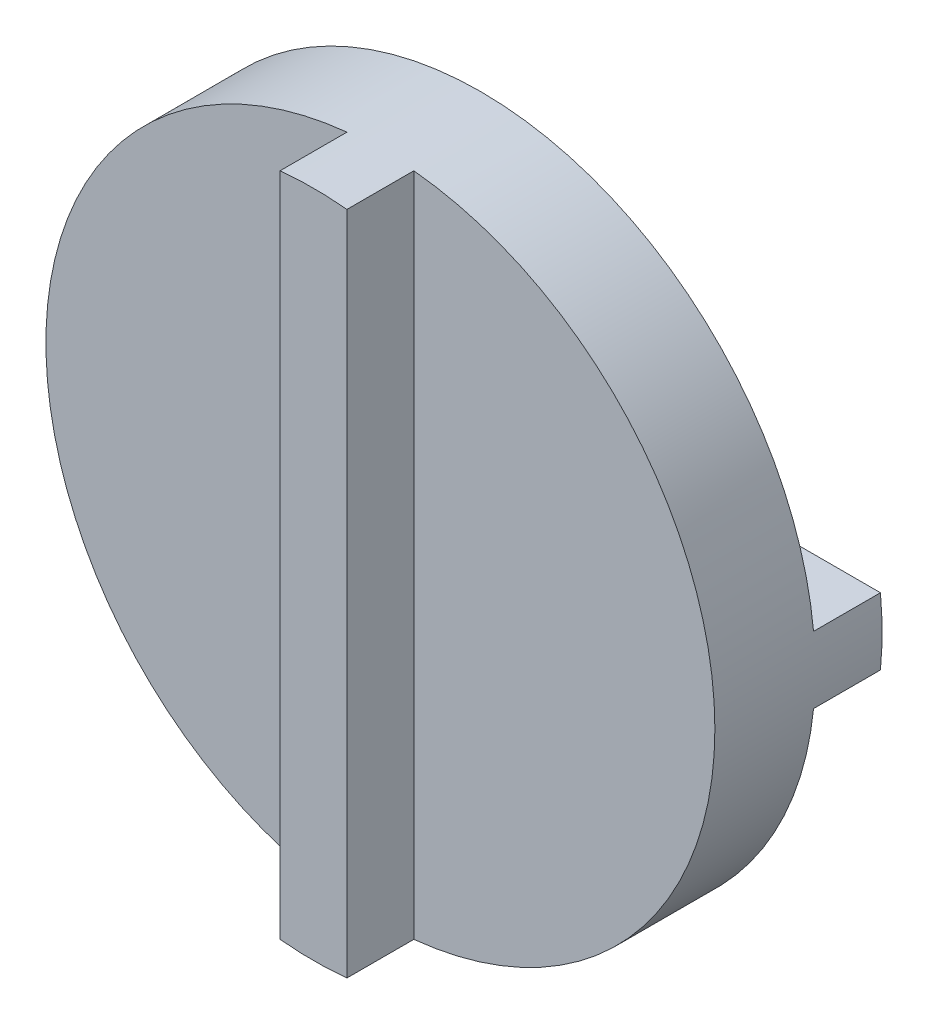
ISO-10303-21;
HEADER;
FILE_DESCRIPTION(('STEP AP214'),'2;1');
FILE_NAME('part.step','',(''),(''),'','','');
FILE_SCHEMA(('AUTOMOTIVE_DESIGN { 1 0 10303 214 1 1 1 1 }'));
ENDSEC;
DATA;
#1=APPLICATION_CONTEXT('core data for automotive mechanical design processes');
#2=APPLICATION_PROTOCOL_DEFINITION('international standard','automotive_design',2000,#1);
#3=PRODUCT_CONTEXT('',#1,'mechanical');
#4=PRODUCT('Part','Part','',(#3));
#5=PRODUCT_RELATED_PRODUCT_CATEGORY('part','',(#4));
#6=PRODUCT_DEFINITION_FORMATION('','',#4);
#7=PRODUCT_DEFINITION_CONTEXT('part definition',#1,'design');
#8=PRODUCT_DEFINITION('design','',#6,#7);
#9=PRODUCT_DEFINITION_SHAPE('','',#8);
#10=(LENGTH_UNIT() NAMED_UNIT(*) SI_UNIT(.MILLI.,.METRE.));
#11=(NAMED_UNIT(*) PLANE_ANGLE_UNIT() SI_UNIT($,.RADIAN.));
#12=(NAMED_UNIT(*) SI_UNIT($,.STERADIAN.) SOLID_ANGLE_UNIT());
#13=UNCERTAINTY_MEASURE_WITH_UNIT(LENGTH_MEASURE(1.E-05),#10,'distance_accuracy_value','');
#14=(GEOMETRIC_REPRESENTATION_CONTEXT(3) GLOBAL_UNCERTAINTY_ASSIGNED_CONTEXT((#13)) GLOBAL_UNIT_ASSIGNED_CONTEXT((#10,
#11,#12)) REPRESENTATION_CONTEXT('',''));
#15=CARTESIAN_POINT('',(0.,0.,0.));
#16=DIRECTION('',(0.,0.,1.));
#17=DIRECTION('',(1.,0.,0.));
#18=AXIS2_PLACEMENT_3D('',#15,#16,#17);
#19=CARTESIAN_POINT('',(0.,0.,0.));
#20=DIRECTION('',(0.,0.,1.));
#21=DIRECTION('',(1.,0.,0.));
#22=AXIS2_PLACEMENT_3D('',#19,#20,#21);
#23=PLANE('',#22);
#24=DIRECTION('',(1.,0.,0.));
#25=VECTOR('',#24,1.);
#26=CARTESIAN_POINT('',(49.749371855331,5.,0.));
#27=LINE('',#26,#25);
#28=CARTESIAN_POINT('',(-49.749371855331,5.,0.));
#29=VERTEX_POINT('',#28);
#30=CARTESIAN_POINT('',(49.749371855331,5.,0.));
#31=VERTEX_POINT('',#30);
#32=EDGE_CURVE('E55',#29,#31,#27,.T.);
#33=ORIENTED_EDGE('',*,*,#32,.F.);
#34=CARTESIAN_POINT('',(0.,0.,0.));
#35=DIRECTION('',(0.,0.,1.));
#36=DIRECTION('',(1.,0.,0.));
#37=AXIS2_PLACEMENT_3D('',#34,#35,#36);
#38=CIRCLE('',#37,50.);
#39=EDGE_CURVE('E37',#31,#29,#38,.T.);
#40=ORIENTED_EDGE('',*,*,#39,.F.);
#41=EDGE_LOOP('',(#33,#40));
#42=FACE_BOUND('',#41,.T.);
#43=ADVANCED_FACE('F33',(#42),#23,.F.);
#44=DIRECTION('',(-1.,0.,0.));
#45=VECTOR('',#44,1.);
#46=CARTESIAN_POINT('',(49.749371855331,-5.,0.));
#47=LINE('',#46,#45);
#48=CARTESIAN_POINT('',(49.749371855331,-5.,0.));
#49=VERTEX_POINT('',#48);
#50=CARTESIAN_POINT('',(-49.749371855331,-5.,0.));
#51=VERTEX_POINT('',#50);
#52=EDGE_CURVE('E48',#49,#51,#47,.T.);
#53=ORIENTED_EDGE('',*,*,#52,.F.);
#54=EDGE_CURVE('E118',#51,#49,#38,.T.);
#55=ORIENTED_EDGE('',*,*,#54,.F.);
#56=EDGE_LOOP('',(#53,#55));
#57=FACE_BOUND('',#56,.T.);
#58=ADVANCED_FACE('F172',(#57),#23,.F.);
#59=CARTESIAN_POINT('',(0.,0.,15.));
#60=DIRECTION('',(0.,0.,1.));
#61=DIRECTION('',(1.,0.,0.));
#62=AXIS2_PLACEMENT_3D('',#59,#60,#61);
#63=PLANE('',#62);
#64=DIRECTION('',(0.,1.,0.));
#65=VECTOR('',#64,1.);
#66=CARTESIAN_POINT('',(5.,49.749371855331,15.));
#67=LINE('',#66,#65);
#68=CARTESIAN_POINT('',(5.00000000000001,-49.749371855331,15.));
#69=VERTEX_POINT('',#68);
#70=CARTESIAN_POINT('',(5.,49.749371855331,15.));
#71=VERTEX_POINT('',#70);
#72=EDGE_CURVE('E122',#69,#71,#67,.T.);
#73=ORIENTED_EDGE('',*,*,#72,.F.);
#74=CARTESIAN_POINT('',(0.,0.,15.));
#75=DIRECTION('',(0.,0.,1.));
#76=DIRECTION('',(1.,0.,0.));
#77=AXIS2_PLACEMENT_3D('',#74,#75,#76);
#78=CIRCLE('',#77,50.);
#79=EDGE_CURVE('E42',#69,#71,#78,.T.);
#80=ORIENTED_EDGE('',*,*,#79,.T.);
#81=EDGE_LOOP('',(#73,#80));
#82=FACE_BOUND('',#81,.T.);
#83=ADVANCED_FACE('F176',(#82),#63,.T.);
#84=CARTESIAN_POINT('',(0.,0.,15.));
#85=DIRECTION('',(0.,0.,-1.));
#86=DIRECTION('',(-1.,0.,0.));
#87=AXIS2_PLACEMENT_3D('',#84,#85,#86);
#88=CYLINDRICAL_SURFACE('',#87,50.);
#89=CARTESIAN_POINT('',(-5.,49.749371855331,15.));
#90=VERTEX_POINT('',#89);
#91=CARTESIAN_POINT('',(-4.99999999999999,-49.749371855331,15.));
#92=VERTEX_POINT('',#91);
#93=EDGE_CURVE('E11',#90,#92,#78,.T.);
#94=ORIENTED_EDGE('',*,*,#93,.F.);
#95=DIRECTION('',(0.,0.,-1.));
#96=VECTOR('',#95,1.);
#97=CARTESIAN_POINT('',(-5.,49.749371855331,25.));
#98=LINE('',#97,#96);
#99=CARTESIAN_POINT('',(-5.,49.749371855331,25.));
#100=VERTEX_POINT('',#99);
#101=EDGE_CURVE('E148',#100,#90,#98,.T.);
#102=ORIENTED_EDGE('',*,*,#101,.F.);
#103=CARTESIAN_POINT('',(0.,0.,25.));
#104=DIRECTION('',(0.,0.,1.));
#105=DIRECTION('',(1.,0.,0.));
#106=AXIS2_PLACEMENT_3D('',#103,#104,#105);
#107=CIRCLE('',#106,50.);
#108=CARTESIAN_POINT('',(5.,49.749371855331,25.));
#109=VERTEX_POINT('',#108);
#110=EDGE_CURVE('E128',#109,#100,#107,.T.);
#111=ORIENTED_EDGE('',*,*,#110,.F.);
#112=DIRECTION('',(0.,0.,-1.));
#113=VECTOR('',#112,1.);
#114=CARTESIAN_POINT('',(5.,49.749371855331,25.));
#115=LINE('',#114,#113);
#116=EDGE_CURVE('E136',#109,#71,#115,.T.);
#117=ORIENTED_EDGE('',*,*,#116,.T.);
#118=ORIENTED_EDGE('',*,*,#79,.F.);
#119=DIRECTION('',(0.,0.,-1.));
#120=VECTOR('',#119,1.);
#121=CARTESIAN_POINT('',(4.99999999999999,-49.749371855331,25.));
#122=LINE('',#121,#120);
#123=CARTESIAN_POINT('',(4.99999999999999,-49.749371855331,25.));
#124=VERTEX_POINT('',#123);
#125=EDGE_CURVE('E142',#124,#69,#122,.T.);
#126=ORIENTED_EDGE('',*,*,#125,.F.);
#127=CARTESIAN_POINT('',(0.,0.,25.));
#128=DIRECTION('',(0.,0.,1.));
#129=DIRECTION('',(1.,0.,0.));
#130=AXIS2_PLACEMENT_3D('',#127,#128,#129);
#131=CIRCLE('',#130,50.);
#132=CARTESIAN_POINT('',(-4.99999999999999,-49.749371855331,25.));
#133=VERTEX_POINT('',#132);
#134=EDGE_CURVE('E133',#133,#124,#131,.T.);
#135=ORIENTED_EDGE('',*,*,#134,.F.);
#136=DIRECTION('',(0.,0.,-1.));
#137=VECTOR('',#136,1.);
#138=CARTESIAN_POINT('',(-4.99999999999999,-49.749371855331,25.));
#139=LINE('',#138,#137);
#140=EDGE_CURVE('E145',#133,#92,#139,.T.);
#141=ORIENTED_EDGE('',*,*,#140,.T.);
#142=EDGE_LOOP('',(#94,#102,#111,#117,#118,#126,#135,#141));
#143=FACE_BOUND('',#142,.T.);
#144=ORIENTED_EDGE('',*,*,#39,.T.);
#145=DIRECTION('',(0.,0.,1.));
#146=VECTOR('',#145,1.);
#147=CARTESIAN_POINT('',(-49.749371855331,5.,-10.));
#148=LINE('',#147,#146);
#149=CARTESIAN_POINT('',(-49.749371855331,5.,-10.));
#150=VERTEX_POINT('',#149);
#151=EDGE_CURVE('E124',#150,#29,#148,.T.);
#152=ORIENTED_EDGE('',*,*,#151,.F.);
#153=CARTESIAN_POINT('',(0.,0.,-10.));
#154=DIRECTION('',(0.,0.,-1.));
#155=DIRECTION('',(-1.,0.,0.));
#156=AXIS2_PLACEMENT_3D('',#153,#154,#155);
#157=CIRCLE('',#156,50.);
#158=CARTESIAN_POINT('',(-49.749371855331,-5.,-10.));
#159=VERTEX_POINT('',#158);
#160=EDGE_CURVE('E107',#159,#150,#157,.T.);
#161=ORIENTED_EDGE('',*,*,#160,.F.);
#162=DIRECTION('',(0.,0.,1.));
#163=VECTOR('',#162,1.);
#164=CARTESIAN_POINT('',(-49.749371855331,-5.,-10.));
#165=LINE('',#164,#163);
#166=EDGE_CURVE('E104',#159,#51,#165,.T.);
#167=ORIENTED_EDGE('',*,*,#166,.T.);
#168=ORIENTED_EDGE('',*,*,#54,.T.);
#169=DIRECTION('',(0.,0.,1.));
#170=VECTOR('',#169,1.);
#171=CARTESIAN_POINT('',(49.749371855331,-5.,-10.));
#172=LINE('',#171,#170);
#173=CARTESIAN_POINT('',(49.749371855331,-5.,-10.));
#174=VERTEX_POINT('',#173);
#175=EDGE_CURVE('E102',#174,#49,#172,.T.);
#176=ORIENTED_EDGE('',*,*,#175,.F.);
#177=CARTESIAN_POINT('',(0.,0.,-10.));
#178=DIRECTION('',(0.,0.,-1.));
#179=DIRECTION('',(-1.,0.,0.));
#180=AXIS2_PLACEMENT_3D('',#177,#178,#179);
#181=CIRCLE('',#180,50.);
#182=CARTESIAN_POINT('',(49.749371855331,5.,-10.));
#183=VERTEX_POINT('',#182);
#184=EDGE_CURVE('E108',#183,#174,#181,.T.);
#185=ORIENTED_EDGE('',*,*,#184,.F.);
#186=DIRECTION('',(0.,0.,1.));
#187=VECTOR('',#186,1.);
#188=CARTESIAN_POINT('',(49.749371855331,5.,-10.));
#189=LINE('',#188,#187);
#190=EDGE_CURVE('E154',#183,#31,#189,.T.);
#191=ORIENTED_EDGE('',*,*,#190,.T.);
#192=EDGE_LOOP('',(#144,#152,#161,#167,#168,#176,#185,#191));
#193=FACE_BOUND('',#192,.T.);
#194=ADVANCED_FACE('F35',(#143,#193),#88,.T.);
#195=DIRECTION('',(0.,-1.,0.));
#196=VECTOR('',#195,1.);
#197=CARTESIAN_POINT('',(-5.,49.749371855331,15.));
#198=LINE('',#197,#196);
#199=EDGE_CURVE('E119',#90,#92,#198,.T.);
#200=ORIENTED_EDGE('',*,*,#199,.F.);
#201=ORIENTED_EDGE('',*,*,#93,.T.);
#202=EDGE_LOOP('',(#200,#201));
#203=FACE_BOUND('',#202,.T.);
#204=ADVANCED_FACE('F178',(#203),#63,.T.);
#205=CARTESIAN_POINT('',(-5.,49.749371855331,25.));
#206=DIRECTION('',(1.,0.,0.));
#207=DIRECTION('',(0.,1.,0.));
#208=AXIS2_PLACEMENT_3D('',#205,#206,#207);
#209=PLANE('',#208);
#210=ORIENTED_EDGE('',*,*,#199,.T.);
#211=ORIENTED_EDGE('',*,*,#140,.F.);
#212=DIRECTION('',(0.,-1.,0.));
#213=VECTOR('',#212,1.);
#214=CARTESIAN_POINT('',(-5.,49.749371855331,25.));
#215=LINE('',#214,#213);
#216=EDGE_CURVE('E131',#100,#133,#215,.T.);
#217=ORIENTED_EDGE('',*,*,#216,.F.);
#218=ORIENTED_EDGE('',*,*,#101,.T.);
#219=EDGE_LOOP('',(#210,#211,#217,#218));
#220=FACE_BOUND('',#219,.T.);
#221=ADVANCED_FACE('F181',(#220),#209,.F.);
#222=CARTESIAN_POINT('',(5.,49.749371855331,25.));
#223=DIRECTION('',(-1.,0.,0.));
#224=DIRECTION('',(0.,-1.,0.));
#225=AXIS2_PLACEMENT_3D('',#222,#223,#224);
#226=PLANE('',#225);
#227=ORIENTED_EDGE('',*,*,#72,.T.);
#228=ORIENTED_EDGE('',*,*,#116,.F.);
#229=DIRECTION('',(0.,1.,0.));
#230=VECTOR('',#229,1.);
#231=CARTESIAN_POINT('',(5.,49.749371855331,25.));
#232=LINE('',#231,#230);
#233=EDGE_CURVE('E135',#124,#109,#232,.T.);
#234=ORIENTED_EDGE('',*,*,#233,.F.);
#235=ORIENTED_EDGE('',*,*,#125,.T.);
#236=EDGE_LOOP('',(#227,#228,#234,#235));
#237=FACE_BOUND('',#236,.T.);
#238=ADVANCED_FACE('F185',(#237),#226,.F.);
#239=CARTESIAN_POINT('',(0.,0.,25.));
#240=DIRECTION('',(0.,0.,1.));
#241=DIRECTION('',(1.,0.,0.));
#242=AXIS2_PLACEMENT_3D('',#239,#240,#241);
#243=PLANE('',#242);
#244=ORIENTED_EDGE('',*,*,#110,.T.);
#245=ORIENTED_EDGE('',*,*,#216,.T.);
#246=ORIENTED_EDGE('',*,*,#134,.T.);
#247=ORIENTED_EDGE('',*,*,#233,.T.);
#248=EDGE_LOOP('',(#244,#245,#246,#247));
#249=FACE_BOUND('',#248,.T.);
#250=ADVANCED_FACE('F169',(#249),#243,.T.);
#251=CARTESIAN_POINT('',(49.749371855331,-5.,-10.));
#252=DIRECTION('',(0.,1.,0.));
#253=DIRECTION('',(0.,0.,1.));
#254=AXIS2_PLACEMENT_3D('',#251,#252,#253);
#255=PLANE('',#254);
#256=ORIENTED_EDGE('',*,*,#52,.T.);
#257=ORIENTED_EDGE('',*,*,#166,.F.);
#258=DIRECTION('',(-1.,0.,0.));
#259=VECTOR('',#258,1.);
#260=CARTESIAN_POINT('',(49.749371855331,-5.,-10.));
#261=LINE('',#260,#259);
#262=EDGE_CURVE('E98',#174,#159,#261,.T.);
#263=ORIENTED_EDGE('',*,*,#262,.F.);
#264=ORIENTED_EDGE('',*,*,#175,.T.);
#265=EDGE_LOOP('',(#256,#257,#263,#264));
#266=FACE_BOUND('',#265,.T.);
#267=ADVANCED_FACE('F100',(#266),#255,.F.);
#268=CARTESIAN_POINT('',(49.749371855331,5.,-10.));
#269=DIRECTION('',(0.,-1.,0.));
#270=DIRECTION('',(0.,0.,-1.));
#271=AXIS2_PLACEMENT_3D('',#268,#269,#270);
#272=PLANE('',#271);
#273=ORIENTED_EDGE('',*,*,#32,.T.);
#274=ORIENTED_EDGE('',*,*,#190,.F.);
#275=DIRECTION('',(1.,0.,0.));
#276=VECTOR('',#275,1.);
#277=CARTESIAN_POINT('',(49.749371855331,5.,-10.));
#278=LINE('',#277,#276);
#279=EDGE_CURVE('E113',#150,#183,#278,.T.);
#280=ORIENTED_EDGE('',*,*,#279,.F.);
#281=ORIENTED_EDGE('',*,*,#151,.T.);
#282=EDGE_LOOP('',(#273,#274,#280,#281));
#283=FACE_BOUND('',#282,.T.);
#284=ADVANCED_FACE('F156',(#283),#272,.F.);
#285=CARTESIAN_POINT('',(0.,0.,-10.));
#286=DIRECTION('',(0.,0.,-1.));
#287=DIRECTION('',(-1.,0.,0.));
#288=AXIS2_PLACEMENT_3D('',#285,#286,#287);
#289=PLANE('',#288);
#290=ORIENTED_EDGE('',*,*,#184,.T.);
#291=ORIENTED_EDGE('',*,*,#262,.T.);
#292=ORIENTED_EDGE('',*,*,#160,.T.);
#293=ORIENTED_EDGE('',*,*,#279,.T.);
#294=EDGE_LOOP('',(#290,#291,#292,#293));
#295=FACE_BOUND('',#294,.T.);
#296=ADVANCED_FACE('F111',(#295),#289,.T.);
#297=CLOSED_SHELL('',(#43,#58,#83,#194,#204,#221,#238,#250,#267,#284,#296));
#298=MANIFOLD_SOLID_BREP('B2',#297);
#299=ADVANCED_BREP_SHAPE_REPRESENTATION('',(#18,#298),#14);
#300=SHAPE_DEFINITION_REPRESENTATION(#9,#299);
ENDSEC;
END-ISO-10303-21;
